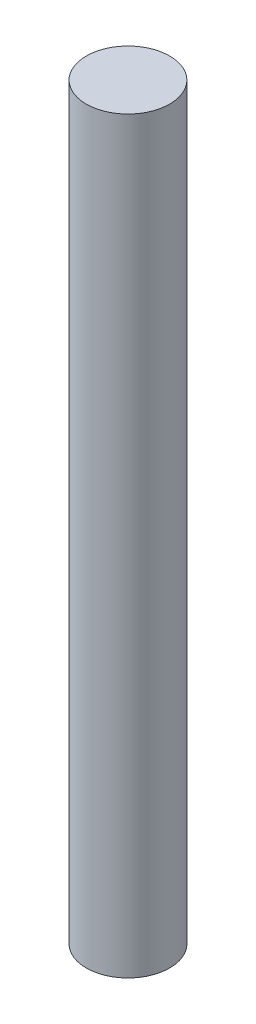
ISO-10303-21;
HEADER;
FILE_DESCRIPTION(('STEP AP214'),'2;1');
FILE_NAME('part.step','',(''),(''),'','','');
FILE_SCHEMA(('AUTOMOTIVE_DESIGN { 1 0 10303 214 1 1 1 1 }'));
ENDSEC;
DATA;
#1=APPLICATION_CONTEXT('core data for automotive mechanical design processes');
#2=APPLICATION_PROTOCOL_DEFINITION('international standard','automotive_design',2000,#1);
#3=PRODUCT_CONTEXT('',#1,'mechanical');
#4=PRODUCT('Part','Part','',(#3));
#5=PRODUCT_RELATED_PRODUCT_CATEGORY('part','',(#4));
#6=PRODUCT_DEFINITION_FORMATION('','',#4);
#7=PRODUCT_DEFINITION_CONTEXT('part definition',#1,'design');
#8=PRODUCT_DEFINITION('design','',#6,#7);
#9=PRODUCT_DEFINITION_SHAPE('','',#8);
#10=(LENGTH_UNIT() NAMED_UNIT(*) SI_UNIT(.MILLI.,.METRE.));
#11=(NAMED_UNIT(*) PLANE_ANGLE_UNIT() SI_UNIT($,.RADIAN.));
#12=(NAMED_UNIT(*) SI_UNIT($,.STERADIAN.) SOLID_ANGLE_UNIT());
#13=UNCERTAINTY_MEASURE_WITH_UNIT(LENGTH_MEASURE(1.E-05),#10,'distance_accuracy_value','');
#14=(GEOMETRIC_REPRESENTATION_CONTEXT(3) GLOBAL_UNCERTAINTY_ASSIGNED_CONTEXT((#13)) GLOBAL_UNIT_ASSIGNED_CONTEXT((#10,
#11,#12)) REPRESENTATION_CONTEXT('',''));
#15=CARTESIAN_POINT('',(0.,0.,0.));
#16=DIRECTION('',(0.,0.,1.));
#17=DIRECTION('',(1.,0.,0.));
#18=AXIS2_PLACEMENT_3D('',#15,#16,#17);
#19=CARTESIAN_POINT('',(0.,35.,0.));
#20=DIRECTION('',(0.,-1.,0.));
#21=DIRECTION('',(0.,0.,-1.));
#22=AXIS2_PLACEMENT_3D('',#19,#20,#21);
#23=CYLINDRICAL_SURFACE('',#22,1.95);
#24=CARTESIAN_POINT('',(0.,35.,0.));
#25=DIRECTION('',(0.,1.,0.));
#26=DIRECTION('',(0.,0.,1.));
#27=AXIS2_PLACEMENT_3D('',#24,#25,#26);
#28=CIRCLE('',#27,1.95);
#29=CARTESIAN_POINT('',(0.,35.,1.95));
#30=VERTEX_POINT('',#29);
#31=EDGE_CURVE('E10',#30,#30,#28,.T.);
#32=ORIENTED_EDGE('',*,*,#31,.F.);
#33=EDGE_LOOP('',(#32));
#34=FACE_BOUND('',#33,.T.);
#35=CARTESIAN_POINT('',(0.,0.,0.));
#36=DIRECTION('',(0.,1.,0.));
#37=DIRECTION('',(0.,0.,1.));
#38=AXIS2_PLACEMENT_3D('',#35,#36,#37);
#39=CIRCLE('',#38,1.95);
#40=CARTESIAN_POINT('',(0.,0.,1.95));
#41=VERTEX_POINT('',#40);
#42=EDGE_CURVE('E46',#41,#41,#39,.T.);
#43=ORIENTED_EDGE('',*,*,#42,.T.);
#44=EDGE_LOOP('',(#43));
#45=FACE_BOUND('',#44,.T.);
#46=ADVANCED_FACE('F43',(#34,#45),#23,.T.);
#47=CARTESIAN_POINT('',(0.,35.,0.));
#48=DIRECTION('',(0.,1.,0.));
#49=DIRECTION('',(0.,0.,1.));
#50=AXIS2_PLACEMENT_3D('',#47,#48,#49);
#51=PLANE('',#50);
#52=ORIENTED_EDGE('',*,*,#31,.T.);
#53=EDGE_LOOP('',(#52));
#54=FACE_BOUND('',#53,.T.);
#55=ADVANCED_FACE('F60',(#54),#51,.T.);
#56=CARTESIAN_POINT('',(0.,0.,0.));
#57=DIRECTION('',(0.,1.,0.));
#58=DIRECTION('',(0.,0.,1.));
#59=AXIS2_PLACEMENT_3D('',#56,#57,#58);
#60=PLANE('',#59);
#61=ORIENTED_EDGE('',*,*,#42,.F.);
#62=EDGE_LOOP('',(#61));
#63=FACE_BOUND('',#62,.T.);
#64=ADVANCED_FACE('F58',(#63),#60,.F.);
#65=CLOSED_SHELL('',(#46,#55,#64));
#66=MANIFOLD_SOLID_BREP('B2',#65);
#67=ADVANCED_BREP_SHAPE_REPRESENTATION('',(#18,#66),#14);
#68=SHAPE_DEFINITION_REPRESENTATION(#9,#67);
ENDSEC;
END-ISO-10303-21;
